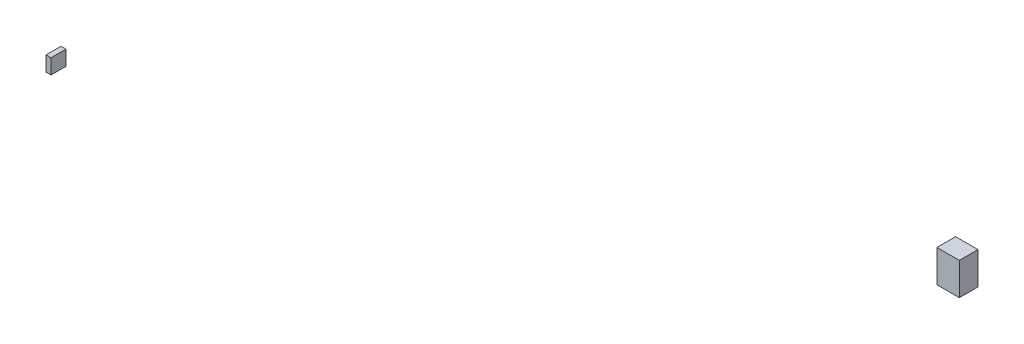
ISO-10303-21;
HEADER;
FILE_DESCRIPTION(('STEP AP214'),'2;1');
FILE_NAME('part.step','',(''),(''),'','','');
FILE_SCHEMA(('AUTOMOTIVE_DESIGN { 1 0 10303 214 1 1 1 1 }'));
ENDSEC;
DATA;
#1=APPLICATION_CONTEXT('core data for automotive mechanical design processes');
#2=APPLICATION_PROTOCOL_DEFINITION('international standard','automotive_design',2000,#1);
#3=PRODUCT_CONTEXT('',#1,'mechanical');
#4=PRODUCT('Part','Part','',(#3));
#5=PRODUCT_RELATED_PRODUCT_CATEGORY('part','',(#4));
#6=PRODUCT_DEFINITION_FORMATION('','',#4);
#7=PRODUCT_DEFINITION_CONTEXT('part definition',#1,'design');
#8=PRODUCT_DEFINITION('design','',#6,#7);
#9=PRODUCT_DEFINITION_SHAPE('','',#8);
#10=(LENGTH_UNIT() NAMED_UNIT(*) SI_UNIT(.MILLI.,.METRE.));
#11=(NAMED_UNIT(*) PLANE_ANGLE_UNIT() SI_UNIT($,.RADIAN.));
#12=(NAMED_UNIT(*) SI_UNIT($,.STERADIAN.) SOLID_ANGLE_UNIT());
#13=UNCERTAINTY_MEASURE_WITH_UNIT(LENGTH_MEASURE(1.E-05),#10,'distance_accuracy_value','');
#14=(GEOMETRIC_REPRESENTATION_CONTEXT(3) GLOBAL_UNCERTAINTY_ASSIGNED_CONTEXT((#13)) GLOBAL_UNIT_ASSIGNED_CONTEXT((#10,
#11,#12)) REPRESENTATION_CONTEXT('',''));
#15=CARTESIAN_POINT('',(0.,0.,0.));
#16=DIRECTION('',(0.,0.,1.));
#17=DIRECTION('',(1.,0.,0.));
#18=AXIS2_PLACEMENT_3D('',#15,#16,#17);
#19=CARTESIAN_POINT('',(1.7971999846381,10.7809724960876,1.36148500329628E-06));
#20=DIRECTION('',(0.,0.,1.));
#21=DIRECTION('',(1.,0.,0.));
#22=AXIS2_PLACEMENT_3D('',#19,#20,#21);
#23=PLANE('',#22);
#24=DIRECTION('',(0.,1.,0.));
#25=VECTOR('',#24,1.);
#26=CARTESIAN_POINT('',(1.7971999846381,9.48097509608758,1.36148500329628E-06));
#27=LINE('',#26,#25);
#28=CARTESIAN_POINT('',(1.7971999846381,9.48097509608758,1.36148500329628E-06));
#29=VERTEX_POINT('',#28);
#30=CARTESIAN_POINT('',(1.7971999846381,10.7809724960876,1.36148500329628E-06));
#31=VERTEX_POINT('',#30);
#32=EDGE_CURVE('P0_E27',#29,#31,#27,.T.);
#33=ORIENTED_EDGE('',*,*,#32,.F.);
#34=DIRECTION('',(-1.,0.,0.));
#35=VECTOR('',#34,1.);
#36=CARTESIAN_POINT('',(2.69719818463807,9.48097509608758,1.36148500329628E-06));
#37=LINE('',#36,#35);
#38=CARTESIAN_POINT('',(2.69719818463807,9.48097509608758,1.36148500329628E-06));
#39=VERTEX_POINT('',#38);
#40=EDGE_CURVE('P0_E81',#39,#29,#37,.T.);
#41=ORIENTED_EDGE('',*,*,#40,.F.);
#42=DIRECTION('',(0.,-1.,0.));
#43=VECTOR('',#42,1.);
#44=CARTESIAN_POINT('',(2.69719818463807,10.7809724960876,1.36148500329628E-06));
#45=LINE('',#44,#43);
#46=CARTESIAN_POINT('',(2.69719818463807,10.7809724960876,1.36148500329628E-06));
#47=VERTEX_POINT('',#46);
#48=EDGE_CURVE('P0_E66',#47,#39,#45,.T.);
#49=ORIENTED_EDGE('',*,*,#48,.F.);
#50=DIRECTION('',(1.,0.,0.));
#51=VECTOR('',#50,1.);
#52=CARTESIAN_POINT('',(1.7971999846381,10.7809724960876,1.36148500329628E-06));
#53=LINE('',#52,#51);
#54=EDGE_CURVE('P0_E106',#31,#47,#53,.T.);
#55=ORIENTED_EDGE('',*,*,#54,.F.);
#56=EDGE_LOOP('',(#33,#41,#49,#55));
#57=FACE_BOUND('',#56,.T.);
#58=ADVANCED_FACE('P0_F17',(#57),#23,.T.);
#59=CARTESIAN_POINT('',(1.7971999846381,10.7809724960876,-0.749999678514997));
#60=DIRECTION('',(0.,0.,1.));
#61=DIRECTION('',(1.,0.,0.));
#62=AXIS2_PLACEMENT_3D('',#59,#60,#61);
#63=PLANE('',#62);
#64=DIRECTION('',(1.,0.,0.));
#65=VECTOR('',#64,1.);
#66=CARTESIAN_POINT('',(1.7971999846381,10.7809724960876,-0.749999678514997));
#67=LINE('',#66,#65);
#68=CARTESIAN_POINT('',(1.7971999846381,10.7809724960876,-0.749999678514997));
#69=VERTEX_POINT('',#68);
#70=CARTESIAN_POINT('',(2.69719818463807,10.7809724960876,-0.749999678514997));
#71=VERTEX_POINT('',#70);
#72=EDGE_CURVE('P0_E97',#69,#71,#67,.T.);
#73=ORIENTED_EDGE('',*,*,#72,.T.);
#74=DIRECTION('',(0.,-1.,0.));
#75=VECTOR('',#74,1.);
#76=CARTESIAN_POINT('',(2.69719818463807,10.7809724960876,-0.749999678514997));
#77=LINE('',#76,#75);
#78=CARTESIAN_POINT('',(2.69719818463807,9.48097509608758,-0.749999678514997));
#79=VERTEX_POINT('',#78);
#80=EDGE_CURVE('P0_E84',#71,#79,#77,.T.);
#81=ORIENTED_EDGE('',*,*,#80,.T.);
#82=DIRECTION('',(-1.,0.,0.));
#83=VECTOR('',#82,1.);
#84=CARTESIAN_POINT('',(2.69719818463807,9.48097509608758,-0.749999678514997));
#85=LINE('',#84,#83);
#86=CARTESIAN_POINT('',(1.7971999846381,9.48097509608758,-0.749999678514997));
#87=VERTEX_POINT('',#86);
#88=EDGE_CURVE('P0_E77',#79,#87,#85,.T.);
#89=ORIENTED_EDGE('',*,*,#88,.T.);
#90=DIRECTION('',(0.,1.,0.));
#91=VECTOR('',#90,1.);
#92=CARTESIAN_POINT('',(1.7971999846381,9.48097509608758,-0.749999678514997));
#93=LINE('',#92,#91);
#94=EDGE_CURVE('P0_E11',#87,#69,#93,.T.);
#95=ORIENTED_EDGE('',*,*,#94,.T.);
#96=EDGE_LOOP('',(#73,#81,#89,#95));
#97=FACE_BOUND('',#96,.T.);
#98=ADVANCED_FACE('P0_F155',(#97),#63,.F.);
#99=CARTESIAN_POINT('',(1.7971999846381,9.48097509608758,-0.749999678514997));
#100=DIRECTION('',(-1.,0.,0.));
#101=DIRECTION('',(0.,1.,0.));
#102=AXIS2_PLACEMENT_3D('',#99,#100,#101);
#103=PLANE('',#102);
#104=DIRECTION('',(0.,0.,1.));
#105=VECTOR('',#104,1.);
#106=CARTESIAN_POINT('',(1.7971999846381,9.48097509608758,-0.749999678514997));
#107=LINE('',#106,#105);
#108=EDGE_CURVE('P0_E83',#87,#29,#107,.T.);
#109=ORIENTED_EDGE('',*,*,#108,.T.);
#110=ORIENTED_EDGE('',*,*,#32,.T.);
#111=DIRECTION('',(0.,0.,1.));
#112=VECTOR('',#111,1.);
#113=CARTESIAN_POINT('',(1.7971999846381,10.7809724960876,-0.749999678514997));
#114=LINE('',#113,#112);
#115=EDGE_CURVE('P0_E108',#69,#31,#114,.T.);
#116=ORIENTED_EDGE('',*,*,#115,.F.);
#117=ORIENTED_EDGE('',*,*,#94,.F.);
#118=EDGE_LOOP('',(#109,#110,#116,#117));
#119=FACE_BOUND('',#118,.T.);
#120=ADVANCED_FACE('P0_F153',(#119),#103,.T.);
#121=CARTESIAN_POINT('',(2.69719818463807,9.48097509608758,-0.749999678514997));
#122=DIRECTION('',(0.,-1.,0.));
#123=DIRECTION('',(-1.,0.,0.));
#124=AXIS2_PLACEMENT_3D('',#121,#122,#123);
#125=PLANE('',#124);
#126=DIRECTION('',(0.,0.,1.));
#127=VECTOR('',#126,1.);
#128=CARTESIAN_POINT('',(2.69719818463807,9.48097509608758,-0.749999678514997));
#129=LINE('',#128,#127);
#130=EDGE_CURVE('P0_E87',#79,#39,#129,.T.);
#131=ORIENTED_EDGE('',*,*,#130,.T.);
#132=ORIENTED_EDGE('',*,*,#40,.T.);
#133=ORIENTED_EDGE('',*,*,#108,.F.);
#134=ORIENTED_EDGE('',*,*,#88,.F.);
#135=EDGE_LOOP('',(#131,#132,#133,#134));
#136=FACE_BOUND('',#135,.T.);
#137=ADVANCED_FACE('P0_F88',(#136),#125,.T.);
#138=CARTESIAN_POINT('',(2.69719818463807,10.7809724960876,-0.749999678514997));
#139=DIRECTION('',(1.,0.,0.));
#140=DIRECTION('',(0.,-1.,0.));
#141=AXIS2_PLACEMENT_3D('',#138,#139,#140);
#142=PLANE('',#141);
#143=DIRECTION('',(0.,0.,1.));
#144=VECTOR('',#143,1.);
#145=CARTESIAN_POINT('',(2.69719818463807,10.7809724960876,-0.749999678514997));
#146=LINE('',#145,#144);
#147=EDGE_CURVE('P0_E94',#71,#47,#146,.T.);
#148=ORIENTED_EDGE('',*,*,#147,.T.);
#149=ORIENTED_EDGE('',*,*,#48,.T.);
#150=ORIENTED_EDGE('',*,*,#130,.F.);
#151=ORIENTED_EDGE('',*,*,#80,.F.);
#152=EDGE_LOOP('',(#148,#149,#150,#151));
#153=FACE_BOUND('',#152,.T.);
#154=ADVANCED_FACE('P0_F92',(#153),#142,.T.);
#155=CARTESIAN_POINT('',(1.7971999846381,10.7809724960876,-0.749999678514997));
#156=DIRECTION('',(0.,1.,0.));
#157=DIRECTION('',(1.,0.,0.));
#158=AXIS2_PLACEMENT_3D('',#155,#156,#157);
#159=PLANE('',#158);
#160=ORIENTED_EDGE('',*,*,#115,.T.);
#161=ORIENTED_EDGE('',*,*,#54,.T.);
#162=ORIENTED_EDGE('',*,*,#147,.F.);
#163=ORIENTED_EDGE('',*,*,#72,.F.);
#164=EDGE_LOOP('',(#160,#161,#162,#163));
#165=FACE_BOUND('',#164,.T.);
#166=ADVANCED_FACE('P0_F197',(#165),#159,.T.);
#167=CLOSED_SHELL('',(#58,#98,#120,#137,#154,#166));
#168=MANIFOLD_SOLID_BREP('P0_B1',#167);
#169=CARTESIAN_POINT('',(-31.1528011153619,1.63096981845756,2.65031474000001));
#170=DIRECTION('',(0.,0.,-1.));
#171=DIRECTION('',(-1.,0.,0.));
#172=AXIS2_PLACEMENT_3D('',#169,#170,#171);
#173=PLANE('',#172);
#174=DIRECTION('',(0.,1.,0.));
#175=VECTOR('',#174,1.);
#176=CARTESIAN_POINT('',(-31.1528011153619,1.63096981845756,2.65031474000001));
#177=LINE('',#176,#175);
#178=CARTESIAN_POINT('',(-31.1528011153619,1.63096981845756,2.65031474000001));
#179=VERTEX_POINT('',#178);
#180=CARTESIAN_POINT('',(-31.1528011153619,2.23096861845757,2.65031474000001));
#181=VERTEX_POINT('',#180);
#182=EDGE_CURVE('P1_E89',#179,#181,#177,.T.);
#183=ORIENTED_EDGE('',*,*,#182,.T.);
#184=DIRECTION('',(-1.,0.,0.));
#185=VECTOR('',#184,1.);
#186=CARTESIAN_POINT('',(-31.1528011153619,2.23096861845757,2.65031474000001));
#187=LINE('',#186,#185);
#188=CARTESIAN_POINT('',(-31.352800715362,2.23096861845757,2.65031474000001));
#189=VERTEX_POINT('',#188);
#190=EDGE_CURVE('P1_E84',#181,#189,#187,.T.);
#191=ORIENTED_EDGE('',*,*,#190,.T.);
#192=DIRECTION('',(0.,-1.,0.));
#193=VECTOR('',#192,1.);
#194=CARTESIAN_POINT('',(-31.352800715362,2.23096861845757,2.65031474000001));
#195=LINE('',#194,#193);
#196=CARTESIAN_POINT('',(-31.352800715362,1.63096981845756,2.65031474000001));
#197=VERTEX_POINT('',#196);
#198=EDGE_CURVE('P1_E110',#189,#197,#195,.T.);
#199=ORIENTED_EDGE('',*,*,#198,.T.);
#200=DIRECTION('',(1.,0.,0.));
#201=VECTOR('',#200,1.);
#202=CARTESIAN_POINT('',(-31.352800715362,1.63096981845756,2.65031474000001));
#203=LINE('',#202,#201);
#204=EDGE_CURVE('P1_E11',#197,#179,#203,.T.);
#205=ORIENTED_EDGE('',*,*,#204,.T.);
#206=EDGE_LOOP('',(#183,#191,#199,#205));
#207=FACE_BOUND('',#206,.T.);
#208=ADVANCED_FACE('P1_F17',(#207),#173,.F.);
#209=CARTESIAN_POINT('',(-31.1528011153619,1.63096981845756,2.05031594000001));
#210=DIRECTION('',(0.,0.,-1.));
#211=DIRECTION('',(-1.,0.,0.));
#212=AXIS2_PLACEMENT_3D('',#209,#210,#211);
#213=PLANE('',#212);
#214=DIRECTION('',(1.,0.,0.));
#215=VECTOR('',#214,1.);
#216=CARTESIAN_POINT('',(-31.352800715362,1.63096981845756,2.05031594000001));
#217=LINE('',#216,#215);
#218=CARTESIAN_POINT('',(-31.352800715362,1.63096981845756,2.05031594000001));
#219=VERTEX_POINT('',#218);
#220=CARTESIAN_POINT('',(-31.1528011153619,1.63096981845756,2.05031594000001));
#221=VERTEX_POINT('',#220);
#222=EDGE_CURVE('P1_E26',#219,#221,#217,.T.);
#223=ORIENTED_EDGE('',*,*,#222,.F.);
#224=DIRECTION('',(0.,-1.,0.));
#225=VECTOR('',#224,1.);
#226=CARTESIAN_POINT('',(-31.352800715362,2.23096861845757,2.05031594000001));
#227=LINE('',#226,#225);
#228=CARTESIAN_POINT('',(-31.352800715362,2.23096861845757,2.05031594000001));
#229=VERTEX_POINT('',#228);
#230=EDGE_CURVE('P1_E72',#229,#219,#227,.T.);
#231=ORIENTED_EDGE('',*,*,#230,.F.);
#232=DIRECTION('',(-1.,0.,0.));
#233=VECTOR('',#232,1.);
#234=CARTESIAN_POINT('',(-31.1528011153619,2.23096861845757,2.05031594000001));
#235=LINE('',#234,#233);
#236=CARTESIAN_POINT('',(-31.1528011153619,2.23096861845757,2.05031594000001));
#237=VERTEX_POINT('',#236);
#238=EDGE_CURVE('P1_E66',#237,#229,#235,.T.);
#239=ORIENTED_EDGE('',*,*,#238,.F.);
#240=DIRECTION('',(0.,1.,0.));
#241=VECTOR('',#240,1.);
#242=CARTESIAN_POINT('',(-31.1528011153619,1.63096981845756,2.05031594000001));
#243=LINE('',#242,#241);
#244=EDGE_CURVE('P1_E70',#221,#237,#243,.T.);
#245=ORIENTED_EDGE('',*,*,#244,.F.);
#246=EDGE_LOOP('',(#223,#231,#239,#245));
#247=FACE_BOUND('',#246,.T.);
#248=ADVANCED_FACE('P1_F68',(#247),#213,.T.);
#249=CARTESIAN_POINT('',(-31.352800715362,1.63096981845756,2.05031594000001));
#250=DIRECTION('',(0.,1.,0.));
#251=DIRECTION('',(1.,0.,0.));
#252=AXIS2_PLACEMENT_3D('',#249,#250,#251);
#253=PLANE('',#252);
#254=ORIENTED_EDGE('',*,*,#222,.T.);
#255=DIRECTION('',(0.,0.,1.));
#256=VECTOR('',#255,1.);
#257=CARTESIAN_POINT('',(-31.1528011153619,1.63096981845756,2.05031594000001));
#258=LINE('',#257,#256);
#259=EDGE_CURVE('P1_E78',#221,#179,#258,.T.);
#260=ORIENTED_EDGE('',*,*,#259,.T.);
#261=ORIENTED_EDGE('',*,*,#204,.F.);
#262=DIRECTION('',(0.,0.,1.));
#263=VECTOR('',#262,1.);
#264=CARTESIAN_POINT('',(-31.352800715362,1.63096981845756,2.05031594000001));
#265=LINE('',#264,#263);
#266=EDGE_CURVE('P1_E113',#219,#197,#265,.T.);
#267=ORIENTED_EDGE('',*,*,#266,.F.);
#268=EDGE_LOOP('',(#254,#260,#261,#267));
#269=FACE_BOUND('',#268,.T.);
#270=ADVANCED_FACE('P1_F144',(#269),#253,.F.);
#271=CARTESIAN_POINT('',(-31.352800715362,2.23096861845757,2.05031594000001));
#272=DIRECTION('',(1.,0.,0.));
#273=DIRECTION('',(0.,-1.,0.));
#274=AXIS2_PLACEMENT_3D('',#271,#272,#273);
#275=PLANE('',#274);
#276=ORIENTED_EDGE('',*,*,#230,.T.);
#277=ORIENTED_EDGE('',*,*,#266,.T.);
#278=ORIENTED_EDGE('',*,*,#198,.F.);
#279=DIRECTION('',(0.,0.,1.));
#280=VECTOR('',#279,1.);
#281=CARTESIAN_POINT('',(-31.352800715362,2.23096861845757,2.05031594000001));
#282=LINE('',#281,#280);
#283=EDGE_CURVE('P1_E77',#229,#189,#282,.T.);
#284=ORIENTED_EDGE('',*,*,#283,.F.);
#285=EDGE_LOOP('',(#276,#277,#278,#284));
#286=FACE_BOUND('',#285,.T.);
#287=ADVANCED_FACE('P1_F143',(#286),#275,.F.);
#288=CARTESIAN_POINT('',(-31.1528011153619,2.23096861845757,2.05031594000001));
#289=DIRECTION('',(0.,-1.,0.));
#290=DIRECTION('',(-1.,0.,0.));
#291=AXIS2_PLACEMENT_3D('',#288,#289,#290);
#292=PLANE('',#291);
#293=ORIENTED_EDGE('',*,*,#238,.T.);
#294=ORIENTED_EDGE('',*,*,#283,.T.);
#295=ORIENTED_EDGE('',*,*,#190,.F.);
#296=DIRECTION('',(0.,0.,1.));
#297=VECTOR('',#296,1.);
#298=CARTESIAN_POINT('',(-31.1528011153619,2.23096861845757,2.05031594000001));
#299=LINE('',#298,#297);
#300=EDGE_CURVE('P1_E81',#237,#181,#299,.T.);
#301=ORIENTED_EDGE('',*,*,#300,.F.);
#302=EDGE_LOOP('',(#293,#294,#295,#301));
#303=FACE_BOUND('',#302,.T.);
#304=ADVANCED_FACE('P1_F82',(#303),#292,.F.);
#305=CARTESIAN_POINT('',(-31.1528011153619,1.63096981845756,2.05031594000001));
#306=DIRECTION('',(-1.,0.,0.));
#307=DIRECTION('',(0.,1.,0.));
#308=AXIS2_PLACEMENT_3D('',#305,#306,#307);
#309=PLANE('',#308);
#310=ORIENTED_EDGE('',*,*,#244,.T.);
#311=ORIENTED_EDGE('',*,*,#300,.T.);
#312=ORIENTED_EDGE('',*,*,#182,.F.);
#313=ORIENTED_EDGE('',*,*,#259,.F.);
#314=EDGE_LOOP('',(#310,#311,#312,#313));
#315=FACE_BOUND('',#314,.T.);
#316=ADVANCED_FACE('P1_F92',(#315),#309,.F.);
#317=CLOSED_SHELL('',(#208,#248,#270,#287,#304,#316));
#318=MANIFOLD_SOLID_BREP('P1_B1',#317);
#319=ADVANCED_BREP_SHAPE_REPRESENTATION('',(#18,#168,#318),#14);
#320=SHAPE_DEFINITION_REPRESENTATION(#9,#319);
ENDSEC;
END-ISO-10303-21;
